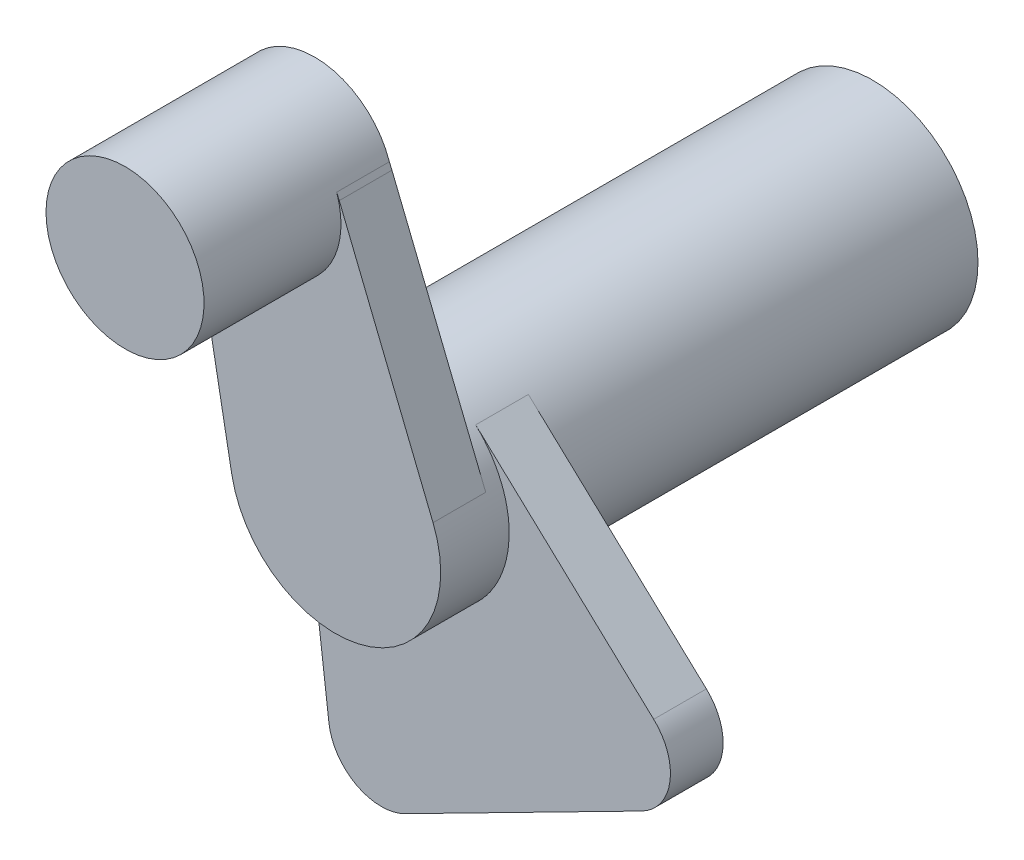
ISO-10303-21;
HEADER;
FILE_DESCRIPTION(('STEP AP214'),'2;1');
FILE_NAME('part.step','',(''),(''),'','','');
FILE_SCHEMA(('AUTOMOTIVE_DESIGN { 1 0 10303 214 1 1 1 1 }'));
ENDSEC;
DATA;
#1=APPLICATION_CONTEXT('core data for automotive mechanical design processes');
#2=APPLICATION_PROTOCOL_DEFINITION('international standard','automotive_design',2000,#1);
#3=PRODUCT_CONTEXT('',#1,'mechanical');
#4=PRODUCT('Part','Part','',(#3));
#5=PRODUCT_RELATED_PRODUCT_CATEGORY('part','',(#4));
#6=PRODUCT_DEFINITION_FORMATION('','',#4);
#7=PRODUCT_DEFINITION_CONTEXT('part definition',#1,'design');
#8=PRODUCT_DEFINITION('design','',#6,#7);
#9=PRODUCT_DEFINITION_SHAPE('','',#8);
#10=(LENGTH_UNIT() NAMED_UNIT(*) SI_UNIT(.MILLI.,.METRE.));
#11=(NAMED_UNIT(*) PLANE_ANGLE_UNIT() SI_UNIT($,.RADIAN.));
#12=(NAMED_UNIT(*) SI_UNIT($,.STERADIAN.) SOLID_ANGLE_UNIT());
#13=UNCERTAINTY_MEASURE_WITH_UNIT(LENGTH_MEASURE(1.E-05),#10,'distance_accuracy_value','');
#14=(GEOMETRIC_REPRESENTATION_CONTEXT(3) GLOBAL_UNCERTAINTY_ASSIGNED_CONTEXT((#13)) GLOBAL_UNIT_ASSIGNED_CONTEXT((#10,
#11,#12)) REPRESENTATION_CONTEXT('',''));
#15=CARTESIAN_POINT('',(0.,0.,0.));
#16=DIRECTION('',(0.,0.,1.));
#17=DIRECTION('',(1.,0.,0.));
#18=AXIS2_PLACEMENT_3D('',#15,#16,#17);
#19=CARTESIAN_POINT('',(-4.28991610237482,-47.081484787417,79.));
#20=DIRECTION('',(0.,0.,1.));
#21=DIRECTION('',(1.,0.,0.));
#22=AXIS2_PLACEMENT_3D('',#19,#20,#21);
#23=CYLINDRICAL_SURFACE('',#22,10.);
#24=CARTESIAN_POINT('',(-4.28991610237482,-47.081484787417,89.));
#25=DIRECTION('',(0.,0.,1.));
#26=DIRECTION('',(1.,0.,0.));
#27=AXIS2_PLACEMENT_3D('',#24,#25,#26);
#28=CIRCLE('',#27,10.);
#29=CARTESIAN_POINT('',(0.250812376207651,-55.9911303967435,89.));
#30=VERTEX_POINT('',#29);
#31=CARTESIAN_POINT('',(-14.2152649403242,-48.3010955634505,89.));
#32=VERTEX_POINT('',#31);
#33=EDGE_CURVE('E142',#30,#32,#28,.F.);
#34=ORIENTED_EDGE('',*,*,#33,.T.);
#35=DIRECTION('',(0.,0.,1.));
#36=VECTOR('',#35,1.);
#37=CARTESIAN_POINT('',(-14.2152649403242,-48.3010955634505,79.));
#38=LINE('',#37,#36);
#39=CARTESIAN_POINT('',(-14.2152649403242,-48.3010955634505,79.));
#40=VERTEX_POINT('',#39);
#41=EDGE_CURVE('E12',#40,#32,#38,.T.);
#42=ORIENTED_EDGE('',*,*,#41,.F.);
#43=CARTESIAN_POINT('',(-4.28991610237482,-47.081484787417,79.));
#44=DIRECTION('',(0.,0.,1.));
#45=DIRECTION('',(1.,0.,0.));
#46=AXIS2_PLACEMENT_3D('',#43,#44,#45);
#47=CIRCLE('',#46,10.);
#48=CARTESIAN_POINT('',(0.250812376207651,-55.9911303967435,79.));
#49=VERTEX_POINT('',#48);
#50=EDGE_CURVE('E154',#49,#40,#47,.F.);
#51=ORIENTED_EDGE('',*,*,#50,.F.);
#52=DIRECTION('',(0.,0.,1.));
#53=VECTOR('',#52,1.);
#54=CARTESIAN_POINT('',(0.250812376207651,-55.9911303967435,79.));
#55=LINE('',#54,#53);
#56=EDGE_CURVE('E60',#49,#30,#55,.T.);
#57=ORIENTED_EDGE('',*,*,#56,.T.);
#58=EDGE_LOOP('',(#34,#42,#51,#57));
#59=FACE_BOUND('',#58,.T.);
#60=ADVANCED_FACE('F57',(#59),#23,.T.);
#61=CARTESIAN_POINT('',(-19.8506976758987,-2.43922155206711,79.));
#62=DIRECTION('',(0.992534883794937,0.121961077603356,0.));
#63=DIRECTION('',(-0.121961077603356,0.992534883794937,0.));
#64=AXIS2_PLACEMENT_3D('',#61,#62,#63);
#65=PLANE('',#64);
#66=DIRECTION('',(-0.121961077603356,0.992534883794937,0.));
#67=VECTOR('',#66,1.);
#68=CARTESIAN_POINT('',(-19.8506976758987,-2.43922155206711,89.));
#69=LINE('',#68,#67);
#70=CARTESIAN_POINT('',(-19.8506976758987,-2.43922155206711,89.));
#71=VERTEX_POINT('',#70);
#72=EDGE_CURVE('E94',#32,#71,#69,.T.);
#73=ORIENTED_EDGE('',*,*,#72,.T.);
#74=DIRECTION('',(0.,0.,1.));
#75=VECTOR('',#74,1.);
#76=CARTESIAN_POINT('',(-19.8506976758987,-2.43922155206711,79.));
#77=LINE('',#76,#75);
#78=CARTESIAN_POINT('',(-19.8506976758987,-2.43922155206711,79.));
#79=VERTEX_POINT('',#78);
#80=EDGE_CURVE('E66',#79,#71,#77,.T.);
#81=ORIENTED_EDGE('',*,*,#80,.F.);
#82=DIRECTION('',(-0.121961077603356,0.992534883794937,0.));
#83=VECTOR('',#82,1.);
#84=CARTESIAN_POINT('',(-19.8506976758987,-2.43922155206711,79.));
#85=LINE('',#84,#83);
#86=EDGE_CURVE('E74',#40,#79,#85,.T.);
#87=ORIENTED_EDGE('',*,*,#86,.F.);
#88=ORIENTED_EDGE('',*,*,#41,.T.);
#89=EDGE_LOOP('',(#73,#81,#87,#88));
#90=FACE_BOUND('',#89,.T.);
#91=ADVANCED_FACE('F174',(#90),#65,.F.);
#92=CARTESIAN_POINT('',(0.,0.,79.));
#93=DIRECTION('',(0.,0.,1.));
#94=DIRECTION('',(1.,0.,0.));
#95=AXIS2_PLACEMENT_3D('',#92,#93,#94);
#96=CYLINDRICAL_SURFACE('',#95,20.);
#97=CARTESIAN_POINT('',(0.,0.,89.));
#98=DIRECTION('',(0.,0.,1.));
#99=DIRECTION('',(1.,0.,0.));
#100=AXIS2_PLACEMENT_3D('',#97,#98,#99);
#101=CIRCLE('',#100,20.);
#102=CARTESIAN_POINT('',(13.6386152557079,14.6283346251982,89.));
#103=VERTEX_POINT('',#102);
#104=EDGE_CURVE('E128',#71,#103,#101,.T.);
#105=ORIENTED_EDGE('',*,*,#104,.T.);
#106=DIRECTION('',(0.,0.,1.));
#107=VECTOR('',#106,1.);
#108=CARTESIAN_POINT('',(13.6386152557079,14.6283346251982,79.));
#109=LINE('',#108,#107);
#110=CARTESIAN_POINT('',(13.6386152557079,14.6283346251982,79.));
#111=VERTEX_POINT('',#110);
#112=EDGE_CURVE('E126',#111,#103,#109,.T.);
#113=ORIENTED_EDGE('',*,*,#112,.F.);
#114=CARTESIAN_POINT('',(0.,0.,79.));
#115=DIRECTION('',(0.,0.,1.));
#116=DIRECTION('',(1.,0.,0.));
#117=AXIS2_PLACEMENT_3D('',#114,#115,#116);
#118=CIRCLE('',#117,20.);
#119=EDGE_CURVE('E116',#79,#111,#118,.T.);
#120=ORIENTED_EDGE('',*,*,#119,.F.);
#121=ORIENTED_EDGE('',*,*,#80,.T.);
#122=EDGE_LOOP('',(#105,#113,#120,#121));
#123=FACE_BOUND('',#122,.T.);
#124=ADVANCED_FACE('F127',(#123),#96,.F.);
#125=CARTESIAN_POINT('',(13.6386152557079,14.6283346251982,79.));
#126=DIRECTION('',(0.681930762785395,0.731416731259908,0.));
#127=DIRECTION('',(-0.731416731259908,0.681930762785395,0.));
#128=AXIS2_PLACEMENT_3D('',#125,#126,#127);
#129=PLANE('',#128);
#130=DIRECTION('',(-0.731416731259908,0.681930762785395,0.));
#131=VECTOR('',#130,1.);
#132=CARTESIAN_POINT('',(13.6386152557079,14.6283346251982,89.));
#133=LINE('',#132,#131);
#134=CARTESIAN_POINT('',(47.4350515588881,-16.8815127745956,89.));
#135=VERTEX_POINT('',#134);
#136=EDGE_CURVE('E151',#135,#103,#133,.T.);
#137=ORIENTED_EDGE('',*,*,#136,.F.);
#138=DIRECTION('',(0.,0.,1.));
#139=VECTOR('',#138,1.);
#140=CARTESIAN_POINT('',(47.4350515588881,-16.8815127745956,79.));
#141=LINE('',#140,#139);
#142=CARTESIAN_POINT('',(47.4350515588881,-16.8815127745956,79.));
#143=VERTEX_POINT('',#142);
#144=EDGE_CURVE('E132',#143,#135,#141,.T.);
#145=ORIENTED_EDGE('',*,*,#144,.F.);
#146=DIRECTION('',(-0.731416731259908,0.681930762785395,0.));
#147=VECTOR('',#146,1.);
#148=CARTESIAN_POINT('',(13.6386152557079,14.6283346251982,79.));
#149=LINE('',#148,#147);
#150=EDGE_CURVE('E121',#143,#111,#149,.T.);
#151=ORIENTED_EDGE('',*,*,#150,.T.);
#152=ORIENTED_EDGE('',*,*,#112,.T.);
#153=EDGE_LOOP('',(#137,#145,#151,#152));
#154=FACE_BOUND('',#153,.T.);
#155=ADVANCED_FACE('F134',(#154),#129,.T.);
#156=CARTESIAN_POINT('',(40.6157439310342,-24.1956800871948,79.));
#157=DIRECTION('',(0.,0.,1.));
#158=DIRECTION('',(1.,0.,0.));
#159=AXIS2_PLACEMENT_3D('',#156,#157,#158);
#160=CYLINDRICAL_SURFACE('',#159,10.);
#161=CARTESIAN_POINT('',(40.6157439310342,-24.1956800871948,89.));
#162=DIRECTION('',(0.,0.,1.));
#163=DIRECTION('',(1.,0.,0.));
#164=AXIS2_PLACEMENT_3D('',#161,#162,#163);
#165=CIRCLE('',#164,10.);
#166=CARTESIAN_POINT('',(45.1564724096165,-33.1053256965213,89.));
#167=VERTEX_POINT('',#166);
#168=EDGE_CURVE('E148',#167,#135,#165,.T.);
#169=ORIENTED_EDGE('',*,*,#168,.F.);
#170=DIRECTION('',(0.,0.,1.));
#171=VECTOR('',#170,1.);
#172=CARTESIAN_POINT('',(45.1564724096165,-33.1053256965213,79.));
#173=LINE('',#172,#171);
#174=CARTESIAN_POINT('',(45.1564724096165,-33.1053256965213,79.));
#175=VERTEX_POINT('',#174);
#176=EDGE_CURVE('E157',#175,#167,#173,.T.);
#177=ORIENTED_EDGE('',*,*,#176,.F.);
#178=CARTESIAN_POINT('',(40.6157439310342,-24.1956800871948,79.));
#179=DIRECTION('',(0.,0.,1.));
#180=DIRECTION('',(1.,0.,0.));
#181=AXIS2_PLACEMENT_3D('',#178,#179,#180);
#182=CIRCLE('',#181,10.);
#183=EDGE_CURVE('E135',#175,#143,#182,.T.);
#184=ORIENTED_EDGE('',*,*,#183,.T.);
#185=ORIENTED_EDGE('',*,*,#144,.T.);
#186=EDGE_LOOP('',(#169,#177,#184,#185));
#187=FACE_BOUND('',#186,.T.);
#188=ADVANCED_FACE('F165',(#187),#160,.T.);
#189=CARTESIAN_POINT('',(22.7036423929119,-44.5482280466325,79.));
#190=DIRECTION('',(0.454072847858238,-0.89096456093265,0.));
#191=DIRECTION('',(0.89096456093265,0.454072847858238,0.));
#192=AXIS2_PLACEMENT_3D('',#189,#190,#191);
#193=PLANE('',#192);
#194=DIRECTION('',(0.89096456093265,0.454072847858238,0.));
#195=VECTOR('',#194,1.);
#196=CARTESIAN_POINT('',(22.7036423929119,-44.5482280466325,89.));
#197=LINE('',#196,#195);
#198=EDGE_CURVE('E145',#30,#167,#197,.T.);
#199=ORIENTED_EDGE('',*,*,#198,.F.);
#200=ORIENTED_EDGE('',*,*,#56,.F.);
#201=DIRECTION('',(0.89096456093265,0.454072847858238,0.));
#202=VECTOR('',#201,1.);
#203=CARTESIAN_POINT('',(22.7036423929119,-44.5482280466325,79.));
#204=LINE('',#203,#202);
#205=EDGE_CURVE('E137',#49,#175,#204,.T.);
#206=ORIENTED_EDGE('',*,*,#205,.T.);
#207=ORIENTED_EDGE('',*,*,#176,.T.);
#208=EDGE_LOOP('',(#199,#200,#206,#207));
#209=FACE_BOUND('',#208,.T.);
#210=ADVANCED_FACE('F163',(#209),#193,.T.);
#211=CARTESIAN_POINT('',(0.,0.,79.));
#212=DIRECTION('',(0.,0.,1.));
#213=DIRECTION('',(1.,0.,0.));
#214=AXIS2_PLACEMENT_3D('',#211,#212,#213);
#215=PLANE('',#214);
#216=ORIENTED_EDGE('',*,*,#50,.T.);
#217=ORIENTED_EDGE('',*,*,#86,.T.);
#218=ORIENTED_EDGE('',*,*,#119,.T.);
#219=ORIENTED_EDGE('',*,*,#150,.F.);
#220=ORIENTED_EDGE('',*,*,#183,.F.);
#221=ORIENTED_EDGE('',*,*,#205,.F.);
#222=EDGE_LOOP('',(#216,#217,#218,#219,#220,#221));
#223=FACE_BOUND('',#222,.T.);
#224=ADVANCED_FACE('F118',(#223),#215,.F.);
#225=CARTESIAN_POINT('',(0.,0.,89.));
#226=DIRECTION('',(0.,0.,1.));
#227=DIRECTION('',(1.,0.,0.));
#228=AXIS2_PLACEMENT_3D('',#225,#226,#227);
#229=PLANE('',#228);
#230=ORIENTED_EDGE('',*,*,#33,.F.);
#231=ORIENTED_EDGE('',*,*,#198,.T.);
#232=ORIENTED_EDGE('',*,*,#168,.T.);
#233=ORIENTED_EDGE('',*,*,#136,.T.);
#234=ORIENTED_EDGE('',*,*,#104,.F.);
#235=ORIENTED_EDGE('',*,*,#72,.F.);
#236=EDGE_LOOP('',(#230,#231,#232,#233,#234,#235));
#237=FACE_BOUND('',#236,.T.);
#238=ADVANCED_FACE('F162',(#237),#229,.T.);
#239=CLOSED_SHELL('',(#60,#91,#124,#155,#188,#210,#224,#238));
#240=MANIFOLD_SOLID_BREP('B2',#239);
#241=CARTESIAN_POINT('',(0.,0.,102.));
#242=DIRECTION('',(0.,0.,-1.));
#243=DIRECTION('',(-1.,0.,0.));
#244=AXIS2_PLACEMENT_3D('',#241,#242,#243);
#245=CYLINDRICAL_SURFACE('',#244,20.);
#246=CARTESIAN_POINT('',(0.,0.,0.));
#247=DIRECTION('',(0.,0.,1.));
#248=DIRECTION('',(1.,0.,0.));
#249=AXIS2_PLACEMENT_3D('',#246,#247,#248);
#250=CIRCLE('',#249,20.);
#251=CARTESIAN_POINT('',(20.,0.,0.));
#252=VERTEX_POINT('',#251);
#253=EDGE_CURVE('E317',#252,#252,#250,.T.);
#254=ORIENTED_EDGE('',*,*,#253,.T.);
#255=EDGE_LOOP('',(#254));
#256=FACE_BOUND('',#255,.T.);
#257=CARTESIAN_POINT('',(0.,0.,92.));
#258=DIRECTION('',(0.,0.,1.));
#259=DIRECTION('',(1.,0.,0.));
#260=AXIS2_PLACEMENT_3D('',#257,#258,#259);
#261=CIRCLE('',#260,20.);
#262=CARTESIAN_POINT('',(18.5429845621075,7.49384571027748,92.));
#263=VERTEX_POINT('',#262);
#264=CARTESIAN_POINT('',(-19.6661747654233,-3.63889682401506,92.));
#265=VERTEX_POINT('',#264);
#266=EDGE_CURVE('E55',#263,#265,#261,.T.);
#267=ORIENTED_EDGE('',*,*,#266,.F.);
#268=DIRECTION('',(0.,0.,1.));
#269=VECTOR('',#268,1.);
#270=CARTESIAN_POINT('',(18.5429845621075,7.49384571027748,92.));
#271=LINE('',#270,#269);
#272=CARTESIAN_POINT('',(18.5429845621075,7.49384571027748,102.));
#273=VERTEX_POINT('',#272);
#274=EDGE_CURVE('E306',#263,#273,#271,.T.);
#275=ORIENTED_EDGE('',*,*,#274,.T.);
#276=CARTESIAN_POINT('',(0.,0.,102.));
#277=DIRECTION('',(0.,0.,1.));
#278=DIRECTION('',(1.,0.,0.));
#279=AXIS2_PLACEMENT_3D('',#276,#277,#278);
#280=CIRCLE('',#279,20.);
#281=CARTESIAN_POINT('',(-19.6661747654233,-3.63889682401506,102.));
#282=VERTEX_POINT('',#281);
#283=EDGE_CURVE('E241',#282,#273,#280,.T.);
#284=ORIENTED_EDGE('',*,*,#283,.F.);
#285=DIRECTION('',(0.,0.,1.));
#286=VECTOR('',#285,1.);
#287=CARTESIAN_POINT('',(-19.6661747654233,-3.63889682401506,92.));
#288=LINE('',#287,#286);
#289=EDGE_CURVE('E298',#265,#282,#288,.T.);
#290=ORIENTED_EDGE('',*,*,#289,.F.);
#291=EDGE_LOOP('',(#267,#275,#284,#290));
#292=FACE_BOUND('',#291,.T.);
#293=ADVANCED_FACE('F233',(#256,#292),#245,.T.);
#294=CARTESIAN_POINT('',(0.,0.,102.));
#295=DIRECTION('',(0.,0.,1.));
#296=DIRECTION('',(1.,0.,0.));
#297=AXIS2_PLACEMENT_3D('',#294,#295,#296);
#298=PLANE('',#297);
#299=CARTESIAN_POINT('',(-13.9334718418639,47.8216615493904,102.));
#300=DIRECTION('',(0.,0.,1.));
#301=DIRECTION('',(1.,0.,0.));
#302=AXIS2_PLACEMENT_3D('',#299,#300,#301);
#303=CIRCLE('',#302,15.);
#304=CARTESIAN_POINT('',(-28.6831029159314,45.0924889313791,102.));
#305=VERTEX_POINT('',#304);
#306=CARTESIAN_POINT('',(0.253016385299641,52.6943971035275,102.));
#307=VERTEX_POINT('',#306);
#308=EDGE_CURVE('E335',#305,#307,#303,.T.);
#309=ORIENTED_EDGE('',*,*,#308,.F.);
#310=DIRECTION('',(0.181944841200753,-0.983308738271166,0.));
#311=VECTOR('',#310,1.);
#312=CARTESIAN_POINT('',(-19.6661747654233,-3.63889682401506,102.));
#313=LINE('',#312,#311);
#314=EDGE_CURVE('E248',#305,#282,#313,.T.);
#315=ORIENTED_EDGE('',*,*,#314,.T.);
#316=ORIENTED_EDGE('',*,*,#283,.T.);
#317=DIRECTION('',(-0.374692285513874,0.927149228105373,0.));
#318=VECTOR('',#317,1.);
#319=CARTESIAN_POINT('',(18.5429845621075,7.49384571027748,102.));
#320=LINE('',#319,#318);
#321=CARTESIAN_POINT('',(0.739309321431989,51.5477651396377,102.));
#322=VERTEX_POINT('',#321);
#323=EDGE_CURVE('E324',#273,#322,#320,.T.);
#324=ORIENTED_EDGE('',*,*,#323,.T.);
#325=DIRECTION('',(-0.390443024674025,0.920627093063961,0.));
#326=VECTOR('',#325,1.);
#327=CARTESIAN_POINT('',(19.1555740295821,8.12398453165839,102.));
#328=LINE('',#327,#326);
#329=EDGE_CURVE('E331',#322,#307,#328,.T.);
#330=ORIENTED_EDGE('',*,*,#329,.T.);
#331=EDGE_LOOP('',(#309,#315,#316,#324,#330));
#332=FACE_BOUND('',#331,.T.);
#333=ADVANCED_FACE('F360',(#332),#298,.T.);
#334=CARTESIAN_POINT('',(0.,0.,0.));
#335=DIRECTION('',(0.,0.,1.));
#336=DIRECTION('',(1.,0.,0.));
#337=AXIS2_PLACEMENT_3D('',#334,#335,#336);
#338=PLANE('',#337);
#339=ORIENTED_EDGE('',*,*,#253,.F.);
#340=EDGE_LOOP('',(#339));
#341=FACE_BOUND('',#340,.T.);
#342=ADVANCED_FACE('F366',(#341),#338,.F.);
#343=CARTESIAN_POINT('',(0.,0.,92.));
#344=DIRECTION('',(0.,0.,1.));
#345=DIRECTION('',(1.,0.,0.));
#346=AXIS2_PLACEMENT_3D('',#343,#344,#345);
#347=PLANE('',#346);
#348=DIRECTION('',(0.181944841200753,-0.983308738271166,0.));
#349=VECTOR('',#348,1.);
#350=CARTESIAN_POINT('',(-19.6661747654233,-3.63889682401506,92.));
#351=LINE('',#350,#349);
#352=CARTESIAN_POINT('',(-28.6831029159314,45.0924889313791,92.));
#353=VERTEX_POINT('',#352);
#354=EDGE_CURVE('E291',#353,#265,#351,.T.);
#355=ORIENTED_EDGE('',*,*,#354,.F.);
#356=CARTESIAN_POINT('',(-13.9334718418639,47.8216615493904,92.));
#357=DIRECTION('',(0.,0.,1.));
#358=DIRECTION('',(1.,0.,0.));
#359=AXIS2_PLACEMENT_3D('',#356,#357,#358);
#360=CIRCLE('',#359,15.);
#361=CARTESIAN_POINT('',(0.253016385299586,52.6943971035276,92.));
#362=VERTEX_POINT('',#361);
#363=EDGE_CURVE('E303',#362,#353,#360,.T.);
#364=ORIENTED_EDGE('',*,*,#363,.F.);
#365=DIRECTION('',(-0.390443024674025,0.920627093063961,0.));
#366=VECTOR('',#365,1.);
#367=CARTESIAN_POINT('',(19.1555740295821,8.12398453165839,92.));
#368=LINE('',#367,#366);
#369=CARTESIAN_POINT('',(0.739309321431989,51.5477651396377,92.));
#370=VERTEX_POINT('',#369);
#371=EDGE_CURVE('E328',#370,#362,#368,.T.);
#372=ORIENTED_EDGE('',*,*,#371,.F.);
#373=DIRECTION('',(-0.374692285513874,0.927149228105373,0.));
#374=VECTOR('',#373,1.);
#375=CARTESIAN_POINT('',(18.5429845621075,7.49384571027748,92.));
#376=LINE('',#375,#374);
#377=EDGE_CURVE('E292',#263,#370,#376,.T.);
#378=ORIENTED_EDGE('',*,*,#377,.F.);
#379=ORIENTED_EDGE('',*,*,#266,.T.);
#380=EDGE_LOOP('',(#355,#364,#372,#378,#379));
#381=FACE_BOUND('',#380,.T.);
#382=ADVANCED_FACE('F290',(#381),#347,.F.);
#383=CARTESIAN_POINT('',(19.1555740295821,8.12398453165839,92.));
#384=DIRECTION('',(0.920627093063961,0.390443024674025,0.));
#385=DIRECTION('',(-0.390443024674025,0.920627093063961,0.));
#386=AXIS2_PLACEMENT_3D('',#383,#384,#385);
#387=PLANE('',#386);
#388=ORIENTED_EDGE('',*,*,#329,.F.);
#389=DIRECTION('',(0.,0.,1.));
#390=VECTOR('',#389,1.);
#391=CARTESIAN_POINT('',(0.739309321431989,51.5477651396377,92.));
#392=LINE('',#391,#390);
#393=EDGE_CURVE('E257',#370,#322,#392,.T.);
#394=ORIENTED_EDGE('',*,*,#393,.F.);
#395=ORIENTED_EDGE('',*,*,#371,.T.);
#396=DIRECTION('',(0.,0.,1.));
#397=VECTOR('',#396,1.);
#398=CARTESIAN_POINT('',(0.253016385299586,52.6943971035276,92.));
#399=LINE('',#398,#397);
#400=EDGE_CURVE('E280',#362,#307,#399,.T.);
#401=ORIENTED_EDGE('',*,*,#400,.T.);
#402=EDGE_LOOP('',(#388,#394,#395,#401));
#403=FACE_BOUND('',#402,.T.);
#404=ADVANCED_FACE('F374',(#403),#387,.T.);
#405=CARTESIAN_POINT('',(18.5429845621075,7.49384571027748,92.));
#406=DIRECTION('',(0.927149228105373,0.374692285513874,0.));
#407=DIRECTION('',(-0.374692285513874,0.927149228105373,0.));
#408=AXIS2_PLACEMENT_3D('',#405,#406,#407);
#409=PLANE('',#408);
#410=ORIENTED_EDGE('',*,*,#323,.F.);
#411=ORIENTED_EDGE('',*,*,#274,.F.);
#412=ORIENTED_EDGE('',*,*,#377,.T.);
#413=ORIENTED_EDGE('',*,*,#393,.T.);
#414=EDGE_LOOP('',(#410,#411,#412,#413));
#415=FACE_BOUND('',#414,.T.);
#416=ADVANCED_FACE('F375',(#415),#409,.T.);
#417=CARTESIAN_POINT('',(-19.6661747654233,-3.63889682401506,92.));
#418=DIRECTION('',(-0.983308738271166,-0.181944841200753,0.));
#419=DIRECTION('',(0.181944841200753,-0.983308738271166,0.));
#420=AXIS2_PLACEMENT_3D('',#417,#418,#419);
#421=PLANE('',#420);
#422=ORIENTED_EDGE('',*,*,#314,.F.);
#423=DIRECTION('',(0.,0.,1.));
#424=VECTOR('',#423,1.);
#425=CARTESIAN_POINT('',(-28.6831029159314,45.0924889313791,92.));
#426=LINE('',#425,#424);
#427=EDGE_CURVE('E301',#353,#305,#426,.T.);
#428=ORIENTED_EDGE('',*,*,#427,.F.);
#429=ORIENTED_EDGE('',*,*,#354,.T.);
#430=ORIENTED_EDGE('',*,*,#289,.T.);
#431=EDGE_LOOP('',(#422,#428,#429,#430));
#432=FACE_BOUND('',#431,.T.);
#433=ADVANCED_FACE('F297',(#432),#421,.T.);
#434=CARTESIAN_POINT('',(-13.9334718418639,47.8216615493904,92.));
#435=DIRECTION('',(0.,0.,1.));
#436=DIRECTION('',(1.,0.,0.));
#437=AXIS2_PLACEMENT_3D('',#434,#435,#436);
#438=CYLINDRICAL_SURFACE('',#437,15.);
#439=ORIENTED_EDGE('',*,*,#427,.T.);
#440=ORIENTED_EDGE('',*,*,#308,.T.);
#441=ORIENTED_EDGE('',*,*,#400,.F.);
#442=ORIENTED_EDGE('',*,*,#363,.T.);
#443=EDGE_LOOP('',(#439,#440,#441,#442));
#444=FACE_BOUND('',#443,.T.);
#445=CARTESIAN_POINT('',(-13.9334718418639,47.8216615493904,128.));
#446=DIRECTION('',(0.,0.,-1.));
#447=DIRECTION('',(-1.,0.,0.));
#448=AXIS2_PLACEMENT_3D('',#445,#446,#447);
#449=CIRCLE('',#448,15.);
#450=CARTESIAN_POINT('',(-28.9334718418639,47.8216615493904,128.));
#451=VERTEX_POINT('',#450);
#452=EDGE_CURVE('E344',#451,#451,#449,.T.);
#453=ORIENTED_EDGE('',*,*,#452,.T.);
#454=EDGE_LOOP('',(#453));
#455=FACE_BOUND('',#454,.T.);
#456=ADVANCED_FACE('F349',(#444,#455),#438,.T.);
#457=CARTESIAN_POINT('',(-13.9334718418639,47.8216615493904,128.));
#458=DIRECTION('',(0.,0.,-1.));
#459=DIRECTION('',(-1.,0.,0.));
#460=AXIS2_PLACEMENT_3D('',#457,#458,#459);
#461=PLANE('',#460);
#462=ORIENTED_EDGE('',*,*,#452,.F.);
#463=EDGE_LOOP('',(#462));
#464=FACE_BOUND('',#463,.T.);
#465=ADVANCED_FACE('F351',(#464),#461,.F.);
#466=CLOSED_SHELL('',(#293,#333,#342,#382,#404,#416,#433,#456,#465));
#467=MANIFOLD_SOLID_BREP('B6',#466);
#468=ADVANCED_BREP_SHAPE_REPRESENTATION('',(#18,#240,#467),#14);
#469=SHAPE_DEFINITION_REPRESENTATION(#9,#468);
ENDSEC;
END-ISO-10303-21;
